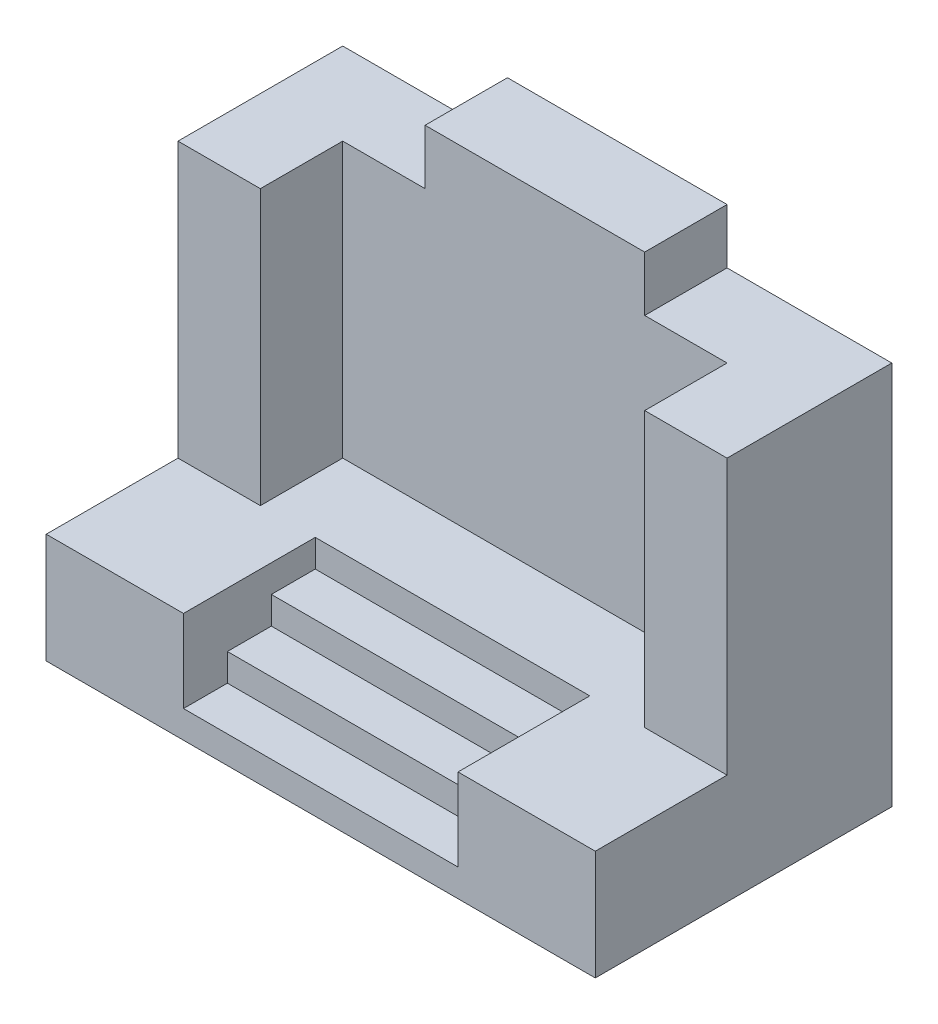
ISO-10303-21;
HEADER;
FILE_DESCRIPTION(('STEP AP214'),'2;1');
FILE_NAME('part.step','',(''),(''),'','','');
FILE_SCHEMA(('AUTOMOTIVE_DESIGN { 1 0 10303 214 1 1 1 1 }'));
ENDSEC;
DATA;
#1=APPLICATION_CONTEXT('core data for automotive mechanical design processes');
#2=APPLICATION_PROTOCOL_DEFINITION('international standard','automotive_design',2000,#1);
#3=PRODUCT_CONTEXT('',#1,'mechanical');
#4=PRODUCT('Part','Part','',(#3));
#5=PRODUCT_RELATED_PRODUCT_CATEGORY('part','',(#4));
#6=PRODUCT_DEFINITION_FORMATION('','',#4);
#7=PRODUCT_DEFINITION_CONTEXT('part definition',#1,'design');
#8=PRODUCT_DEFINITION('design','',#6,#7);
#9=PRODUCT_DEFINITION_SHAPE('','',#8);
#10=(LENGTH_UNIT() NAMED_UNIT(*) SI_UNIT(.MILLI.,.METRE.));
#11=(NAMED_UNIT(*) PLANE_ANGLE_UNIT() SI_UNIT($,.RADIAN.));
#12=(NAMED_UNIT(*) SI_UNIT($,.STERADIAN.) SOLID_ANGLE_UNIT());
#13=UNCERTAINTY_MEASURE_WITH_UNIT(LENGTH_MEASURE(1.E-05),#10,'distance_accuracy_value','');
#14=(GEOMETRIC_REPRESENTATION_CONTEXT(3) GLOBAL_UNCERTAINTY_ASSIGNED_CONTEXT((#13)) GLOBAL_UNIT_ASSIGNED_CONTEXT((#10,
#11,#12)) REPRESENTATION_CONTEXT('',''));
#15=CARTESIAN_POINT('',(0.,0.,0.));
#16=DIRECTION('',(0.,0.,1.));
#17=DIRECTION('',(1.,0.,0.));
#18=AXIS2_PLACEMENT_3D('',#15,#16,#17);
#19=CARTESIAN_POINT('',(-250.,200.,0.));
#20=DIRECTION('',(-1.,0.,0.));
#21=DIRECTION('',(0.,0.,1.));
#22=AXIS2_PLACEMENT_3D('',#19,#20,#21);
#23=PLANE('',#22);
#24=DIRECTION('',(0.,-1.,0.));
#25=VECTOR('',#24,1.);
#26=CARTESIAN_POINT('',(-250.,200.,0.));
#27=LINE('',#26,#25);
#28=CARTESIAN_POINT('',(-250.,200.,0.));
#29=VERTEX_POINT('',#28);
#30=CARTESIAN_POINT('',(-250.,50.,0.));
#31=VERTEX_POINT('',#30);
#32=EDGE_CURVE('E205',#29,#31,#27,.T.);
#33=ORIENTED_EDGE('',*,*,#32,.T.);
#34=DIRECTION('',(0.,0.,-1.));
#35=VECTOR('',#34,1.);
#36=CARTESIAN_POINT('',(-250.,50.,0.));
#37=LINE('',#36,#35);
#38=CARTESIAN_POINT('',(-250.,50.,-80.));
#39=VERTEX_POINT('',#38);
#40=EDGE_CURVE('E186',#31,#39,#37,.T.);
#41=ORIENTED_EDGE('',*,*,#40,.T.);
#42=DIRECTION('',(0.,-1.,0.));
#43=VECTOR('',#42,1.);
#44=CARTESIAN_POINT('',(-250.,100.,-80.));
#45=LINE('',#44,#43);
#46=CARTESIAN_POINT('',(-250.,100.,-80.));
#47=VERTEX_POINT('',#46);
#48=EDGE_CURVE('E200',#47,#39,#45,.T.);
#49=ORIENTED_EDGE('',*,*,#48,.F.);
#50=DIRECTION('',(0.,0.,-1.));
#51=VECTOR('',#50,1.);
#52=CARTESIAN_POINT('',(-250.,100.,0.));
#53=LINE('',#52,#51);
#54=CARTESIAN_POINT('',(-250.,100.,-160.));
#55=VERTEX_POINT('',#54);
#56=EDGE_CURVE('E207',#47,#55,#53,.T.);
#57=ORIENTED_EDGE('',*,*,#56,.T.);
#58=DIRECTION('',(0.,-1.,0.));
#59=VECTOR('',#58,1.);
#60=CARTESIAN_POINT('',(-250.,150.,-160.));
#61=LINE('',#60,#59);
#62=CARTESIAN_POINT('',(-250.,150.,-160.));
#63=VERTEX_POINT('',#62);
#64=EDGE_CURVE('E226',#63,#55,#61,.T.);
#65=ORIENTED_EDGE('',*,*,#64,.F.);
#66=DIRECTION('',(0.,0.,-1.));
#67=VECTOR('',#66,1.);
#68=CARTESIAN_POINT('',(-250.,150.,0.));
#69=LINE('',#68,#67);
#70=CARTESIAN_POINT('',(-250.,150.,-240.));
#71=VERTEX_POINT('',#70);
#72=EDGE_CURVE('E211',#63,#71,#69,.T.);
#73=ORIENTED_EDGE('',*,*,#72,.T.);
#74=DIRECTION('',(0.,-1.,0.));
#75=VECTOR('',#74,1.);
#76=CARTESIAN_POINT('',(-250.,200.,-240.));
#77=LINE('',#76,#75);
#78=CARTESIAN_POINT('',(-250.,200.,-240.));
#79=VERTEX_POINT('',#78);
#80=EDGE_CURVE('E324',#79,#71,#77,.T.);
#81=ORIENTED_EDGE('',*,*,#80,.F.);
#82=DIRECTION('',(0.,0.,-1.));
#83=VECTOR('',#82,1.);
#84=CARTESIAN_POINT('',(-250.,200.,0.));
#85=LINE('',#84,#83);
#86=EDGE_CURVE('E303',#29,#79,#85,.T.);
#87=ORIENTED_EDGE('',*,*,#86,.F.);
#88=EDGE_LOOP('',(#33,#41,#49,#57,#65,#73,#81,#87));
#89=FACE_BOUND('',#88,.T.);
#90=ADVANCED_FACE('F39',(#89),#23,.F.);
#91=CARTESIAN_POINT('',(0.,700.,-540.));
#92=DIRECTION('',(0.,0.,-1.));
#93=DIRECTION('',(-1.,0.,0.));
#94=AXIS2_PLACEMENT_3D('',#91,#92,#93);
#95=PLANE('',#94);
#96=DIRECTION('',(1.,0.,0.));
#97=VECTOR('',#96,1.);
#98=CARTESIAN_POINT('',(0.,0.,-540.));
#99=LINE('',#98,#97);
#100=CARTESIAN_POINT('',(-500.,0.,-540.));
#101=VERTEX_POINT('',#100);
#102=CARTESIAN_POINT('',(500.,0.,-540.));
#103=VERTEX_POINT('',#102);
#104=EDGE_CURVE('E332',#101,#103,#99,.T.);
#105=ORIENTED_EDGE('',*,*,#104,.F.);
#106=DIRECTION('',(0.,-1.,0.));
#107=VECTOR('',#106,1.);
#108=CARTESIAN_POINT('',(-500.,700.,-540.));
#109=LINE('',#108,#107);
#110=CARTESIAN_POINT('',(-500.,700.,-540.));
#111=VERTEX_POINT('',#110);
#112=EDGE_CURVE('E279',#111,#101,#109,.T.);
#113=ORIENTED_EDGE('',*,*,#112,.F.);
#114=DIRECTION('',(1.,0.,0.));
#115=VECTOR('',#114,1.);
#116=CARTESIAN_POINT('',(0.,700.,-540.));
#117=LINE('',#116,#115);
#118=CARTESIAN_POINT('',(-200.,700.,-540.));
#119=VERTEX_POINT('',#118);
#120=EDGE_CURVE('E259',#111,#119,#117,.T.);
#121=ORIENTED_EDGE('',*,*,#120,.T.);
#122=DIRECTION('',(0.,-1.,0.));
#123=VECTOR('',#122,1.);
#124=CARTESIAN_POINT('',(-200.,800.,-540.));
#125=LINE('',#124,#123);
#126=CARTESIAN_POINT('',(-200.,800.,-540.));
#127=VERTEX_POINT('',#126);
#128=EDGE_CURVE('E244',#127,#119,#125,.T.);
#129=ORIENTED_EDGE('',*,*,#128,.F.);
#130=DIRECTION('',(1.,0.,0.));
#131=VECTOR('',#130,1.);
#132=CARTESIAN_POINT('',(0.,800.,-540.));
#133=LINE('',#132,#131);
#134=CARTESIAN_POINT('',(200.,800.,-540.));
#135=VERTEX_POINT('',#134);
#136=EDGE_CURVE('E238',#127,#135,#133,.T.);
#137=ORIENTED_EDGE('',*,*,#136,.T.);
#138=DIRECTION('',(0.,-1.,0.));
#139=VECTOR('',#138,1.);
#140=CARTESIAN_POINT('',(200.,800.,-540.));
#141=LINE('',#140,#139);
#142=CARTESIAN_POINT('',(200.,700.,-540.));
#143=VERTEX_POINT('',#142);
#144=EDGE_CURVE('E243',#135,#143,#141,.T.);
#145=ORIENTED_EDGE('',*,*,#144,.T.);
#146=DIRECTION('',(1.,0.,0.));
#147=VECTOR('',#146,1.);
#148=CARTESIAN_POINT('',(0.,700.,-540.));
#149=LINE('',#148,#147);
#150=CARTESIAN_POINT('',(500.,700.,-540.));
#151=VERTEX_POINT('',#150);
#152=EDGE_CURVE('E335',#143,#151,#149,.T.);
#153=ORIENTED_EDGE('',*,*,#152,.T.);
#154=DIRECTION('',(0.,-1.,0.));
#155=VECTOR('',#154,1.);
#156=CARTESIAN_POINT('',(500.,700.,-540.));
#157=LINE('',#156,#155);
#158=EDGE_CURVE('E350',#151,#103,#157,.T.);
#159=ORIENTED_EDGE('',*,*,#158,.T.);
#160=EDGE_LOOP('',(#105,#113,#121,#129,#137,#145,#153,#159));
#161=FACE_BOUND('',#160,.T.);
#162=ADVANCED_FACE('F41',(#161),#95,.T.);
#163=CARTESIAN_POINT('',(0.,700.,-390.));
#164=DIRECTION('',(0.,0.,-1.));
#165=DIRECTION('',(-1.,0.,0.));
#166=AXIS2_PLACEMENT_3D('',#163,#164,#165);
#167=PLANE('',#166);
#168=DIRECTION('',(1.,0.,0.));
#169=VECTOR('',#168,1.);
#170=CARTESIAN_POINT('',(0.,700.,-390.));
#171=LINE('',#170,#169);
#172=CARTESIAN_POINT('',(200.,700.,-390.));
#173=VERTEX_POINT('',#172);
#174=CARTESIAN_POINT('',(350.,700.,-390.));
#175=VERTEX_POINT('',#174);
#176=EDGE_CURVE('E336',#173,#175,#171,.T.);
#177=ORIENTED_EDGE('',*,*,#176,.F.);
#178=DIRECTION('',(0.,-1.,0.));
#179=VECTOR('',#178,1.);
#180=CARTESIAN_POINT('',(200.,800.,-390.));
#181=LINE('',#180,#179);
#182=CARTESIAN_POINT('',(200.,800.,-390.));
#183=VERTEX_POINT('',#182);
#184=EDGE_CURVE('E248',#183,#173,#181,.T.);
#185=ORIENTED_EDGE('',*,*,#184,.F.);
#186=DIRECTION('',(1.,0.,0.));
#187=VECTOR('',#186,1.);
#188=CARTESIAN_POINT('',(0.,800.,-390.));
#189=LINE('',#188,#187);
#190=CARTESIAN_POINT('',(-200.,800.,-390.));
#191=VERTEX_POINT('',#190);
#192=EDGE_CURVE('E231',#191,#183,#189,.T.);
#193=ORIENTED_EDGE('',*,*,#192,.F.);
#194=DIRECTION('',(0.,-1.,0.));
#195=VECTOR('',#194,1.);
#196=CARTESIAN_POINT('',(-200.,800.,-390.));
#197=LINE('',#196,#195);
#198=CARTESIAN_POINT('',(-200.,700.,-390.));
#199=VERTEX_POINT('',#198);
#200=EDGE_CURVE('E246',#191,#199,#197,.T.);
#201=ORIENTED_EDGE('',*,*,#200,.T.);
#202=DIRECTION('',(1.,0.,0.));
#203=VECTOR('',#202,1.);
#204=CARTESIAN_POINT('',(0.,700.,-390.));
#205=LINE('',#204,#203);
#206=CARTESIAN_POINT('',(-350.,700.,-390.));
#207=VERTEX_POINT('',#206);
#208=EDGE_CURVE('E251',#207,#199,#205,.T.);
#209=ORIENTED_EDGE('',*,*,#208,.F.);
#210=DIRECTION('',(0.,-1.,0.));
#211=VECTOR('',#210,1.);
#212=CARTESIAN_POINT('',(-350.,700.,-390.));
#213=LINE('',#212,#211);
#214=CARTESIAN_POINT('',(-350.,200.,-390.));
#215=VERTEX_POINT('',#214);
#216=EDGE_CURVE('E267',#207,#215,#213,.T.);
#217=ORIENTED_EDGE('',*,*,#216,.T.);
#218=DIRECTION('',(1.,0.,0.));
#219=VECTOR('',#218,1.);
#220=CARTESIAN_POINT('',(0.,200.,-390.));
#221=LINE('',#220,#219);
#222=CARTESIAN_POINT('',(350.,200.,-390.));
#223=VERTEX_POINT('',#222);
#224=EDGE_CURVE('E289',#215,#223,#221,.T.);
#225=ORIENTED_EDGE('',*,*,#224,.T.);
#226=DIRECTION('',(0.,-1.,0.));
#227=VECTOR('',#226,1.);
#228=CARTESIAN_POINT('',(350.,700.,-390.));
#229=LINE('',#228,#227);
#230=EDGE_CURVE('E11',#175,#223,#229,.T.);
#231=ORIENTED_EDGE('',*,*,#230,.F.);
#232=EDGE_LOOP('',(#177,#185,#193,#201,#209,#217,#225,#231));
#233=FACE_BOUND('',#232,.T.);
#234=ADVANCED_FACE('F369',(#233),#167,.F.);
#235=CARTESIAN_POINT('',(350.,700.,-2.59052039079203E-13));
#236=DIRECTION('',(1.,0.,0.));
#237=DIRECTION('',(0.,0.,-1.));
#238=AXIS2_PLACEMENT_3D('',#235,#236,#237);
#239=PLANE('',#238);
#240=ORIENTED_EDGE('',*,*,#230,.T.);
#241=DIRECTION('',(0.,0.,1.));
#242=VECTOR('',#241,1.);
#243=CARTESIAN_POINT('',(350.,200.,-2.59052039079203E-13));
#244=LINE('',#243,#242);
#245=CARTESIAN_POINT('',(350.,200.,-240.));
#246=VERTEX_POINT('',#245);
#247=EDGE_CURVE('E283',#223,#246,#244,.T.);
#248=ORIENTED_EDGE('',*,*,#247,.T.);
#249=DIRECTION('',(0.,-1.,0.));
#250=VECTOR('',#249,1.);
#251=CARTESIAN_POINT('',(350.,700.,-240.));
#252=LINE('',#251,#250);
#253=CARTESIAN_POINT('',(350.,700.,-240.));
#254=VERTEX_POINT('',#253);
#255=EDGE_CURVE('E50',#254,#246,#252,.T.);
#256=ORIENTED_EDGE('',*,*,#255,.F.);
#257=DIRECTION('',(0.,0.,1.));
#258=VECTOR('',#257,1.);
#259=CARTESIAN_POINT('',(350.,700.,-2.59052039079203E-13));
#260=LINE('',#259,#258);
#261=EDGE_CURVE('E342',#175,#254,#260,.T.);
#262=ORIENTED_EDGE('',*,*,#261,.F.);
#263=EDGE_LOOP('',(#240,#248,#256,#262));
#264=FACE_BOUND('',#263,.T.);
#265=ADVANCED_FACE('F361',(#264),#239,.F.);
#266=CARTESIAN_POINT('',(0.,700.,-240.));
#267=DIRECTION('',(0.,0.,-1.));
#268=DIRECTION('',(-1.,0.,0.));
#269=AXIS2_PLACEMENT_3D('',#266,#267,#268);
#270=PLANE('',#269);
#271=ORIENTED_EDGE('',*,*,#255,.T.);
#272=DIRECTION('',(1.,0.,0.));
#273=VECTOR('',#272,1.);
#274=CARTESIAN_POINT('',(0.,200.,-240.));
#275=LINE('',#274,#273);
#276=CARTESIAN_POINT('',(500.,200.,-240.));
#277=VERTEX_POINT('',#276);
#278=EDGE_CURVE('E285',#246,#277,#275,.T.);
#279=ORIENTED_EDGE('',*,*,#278,.T.);
#280=DIRECTION('',(0.,-1.,0.));
#281=VECTOR('',#280,1.);
#282=CARTESIAN_POINT('',(500.,700.,-240.));
#283=LINE('',#282,#281);
#284=CARTESIAN_POINT('',(500.,700.,-240.));
#285=VERTEX_POINT('',#284);
#286=EDGE_CURVE('E354',#285,#277,#283,.T.);
#287=ORIENTED_EDGE('',*,*,#286,.F.);
#288=DIRECTION('',(1.,0.,0.));
#289=VECTOR('',#288,1.);
#290=CARTESIAN_POINT('',(0.,700.,-240.));
#291=LINE('',#290,#289);
#292=EDGE_CURVE('E343',#254,#285,#291,.T.);
#293=ORIENTED_EDGE('',*,*,#292,.F.);
#294=EDGE_LOOP('',(#271,#279,#287,#293));
#295=FACE_BOUND('',#294,.T.);
#296=ADVANCED_FACE('F359',(#295),#270,.F.);
#297=CARTESIAN_POINT('',(500.,700.,-1.02798428206033E-13));
#298=DIRECTION('',(-1.,0.,0.));
#299=DIRECTION('',(0.,0.,1.));
#300=AXIS2_PLACEMENT_3D('',#297,#298,#299);
#301=PLANE('',#300);
#302=DIRECTION('',(0.,0.,-1.));
#303=VECTOR('',#302,1.);
#304=CARTESIAN_POINT('',(500.,0.,-1.02798428206033E-13));
#305=LINE('',#304,#303);
#306=CARTESIAN_POINT('',(500.,0.,-1.11022302462516E-13));
#307=VERTEX_POINT('',#306);
#308=EDGE_CURVE('E337',#307,#103,#305,.T.);
#309=ORIENTED_EDGE('',*,*,#308,.T.);
#310=ORIENTED_EDGE('',*,*,#158,.F.);
#311=DIRECTION('',(0.,0.,-1.));
#312=VECTOR('',#311,1.);
#313=CARTESIAN_POINT('',(500.,700.,-1.02798428206033E-13));
#314=LINE('',#313,#312);
#315=EDGE_CURVE('E341',#285,#151,#314,.T.);
#316=ORIENTED_EDGE('',*,*,#315,.F.);
#317=ORIENTED_EDGE('',*,*,#286,.T.);
#318=DIRECTION('',(0.,0.,-1.));
#319=VECTOR('',#318,1.);
#320=CARTESIAN_POINT('',(500.,200.,-1.02798428206033E-13));
#321=LINE('',#320,#319);
#322=CARTESIAN_POINT('',(500.,200.,-1.11022302462516E-13));
#323=VERTEX_POINT('',#322);
#324=EDGE_CURVE('E313',#323,#277,#321,.T.);
#325=ORIENTED_EDGE('',*,*,#324,.F.);
#326=DIRECTION('',(0.,-1.,0.));
#327=VECTOR('',#326,1.);
#328=CARTESIAN_POINT('',(500.,200.,-1.11022302462516E-13));
#329=LINE('',#328,#327);
#330=EDGE_CURVE('E311',#323,#307,#329,.T.);
#331=ORIENTED_EDGE('',*,*,#330,.T.);
#332=EDGE_LOOP('',(#309,#310,#316,#317,#325,#331));
#333=FACE_BOUND('',#332,.T.);
#334=ADVANCED_FACE('F404',(#333),#301,.F.);
#335=CARTESIAN_POINT('',(0.,700.,0.));
#336=DIRECTION('',(0.,1.,0.));
#337=DIRECTION('',(0.,0.,1.));
#338=AXIS2_PLACEMENT_3D('',#335,#336,#337);
#339=PLANE('',#338);
#340=ORIENTED_EDGE('',*,*,#152,.F.);
#341=DIRECTION('',(0.,0.,1.));
#342=VECTOR('',#341,1.);
#343=CARTESIAN_POINT('',(200.,700.,0.));
#344=LINE('',#343,#342);
#345=EDGE_CURVE('E333',#143,#173,#344,.T.);
#346=ORIENTED_EDGE('',*,*,#345,.T.);
#347=ORIENTED_EDGE('',*,*,#176,.T.);
#348=ORIENTED_EDGE('',*,*,#261,.T.);
#349=ORIENTED_EDGE('',*,*,#292,.T.);
#350=ORIENTED_EDGE('',*,*,#315,.T.);
#351=EDGE_LOOP('',(#340,#346,#347,#348,#349,#350));
#352=FACE_BOUND('',#351,.T.);
#353=ADVANCED_FACE('F406',(#352),#339,.T.);
#354=CARTESIAN_POINT('',(0.,0.,0.));
#355=DIRECTION('',(0.,1.,0.));
#356=DIRECTION('',(0.,0.,1.));
#357=AXIS2_PLACEMENT_3D('',#354,#355,#356);
#358=PLANE('',#357);
#359=ORIENTED_EDGE('',*,*,#308,.F.);
#360=DIRECTION('',(1.,0.,0.));
#361=VECTOR('',#360,1.);
#362=CARTESIAN_POINT('',(0.,0.,0.));
#363=LINE('',#362,#361);
#364=CARTESIAN_POINT('',(-500.,0.,0.));
#365=VERTEX_POINT('',#364);
#366=EDGE_CURVE('E287',#365,#307,#363,.T.);
#367=ORIENTED_EDGE('',*,*,#366,.F.);
#368=DIRECTION('',(0.,0.,-1.));
#369=VECTOR('',#368,1.);
#370=CARTESIAN_POINT('',(-500.,0.,0.));
#371=LINE('',#370,#369);
#372=EDGE_CURVE('E282',#365,#101,#371,.T.);
#373=ORIENTED_EDGE('',*,*,#372,.T.);
#374=ORIENTED_EDGE('',*,*,#104,.T.);
#375=EDGE_LOOP('',(#359,#367,#373,#374));
#376=FACE_BOUND('',#375,.T.);
#377=ADVANCED_FACE('F450',(#376),#358,.F.);
#378=CARTESIAN_POINT('',(-500.,200.,0.));
#379=DIRECTION('',(-1.,0.,0.));
#380=DIRECTION('',(0.,0.,1.));
#381=AXIS2_PLACEMENT_3D('',#378,#379,#380);
#382=PLANE('',#381);
#383=ORIENTED_EDGE('',*,*,#372,.F.);
#384=DIRECTION('',(0.,-1.,0.));
#385=VECTOR('',#384,1.);
#386=CARTESIAN_POINT('',(-500.,200.,0.));
#387=LINE('',#386,#385);
#388=CARTESIAN_POINT('',(-500.,200.,0.));
#389=VERTEX_POINT('',#388);
#390=EDGE_CURVE('E328',#389,#365,#387,.T.);
#391=ORIENTED_EDGE('',*,*,#390,.F.);
#392=DIRECTION('',(0.,0.,-1.));
#393=VECTOR('',#392,1.);
#394=CARTESIAN_POINT('',(-500.,200.,0.));
#395=LINE('',#394,#393);
#396=CARTESIAN_POINT('',(-500.,200.,-240.));
#397=VERTEX_POINT('',#396);
#398=EDGE_CURVE('E299',#389,#397,#395,.T.);
#399=ORIENTED_EDGE('',*,*,#398,.T.);
#400=DIRECTION('',(0.,-1.,0.));
#401=VECTOR('',#400,1.);
#402=CARTESIAN_POINT('',(-500.,700.,-240.));
#403=LINE('',#402,#401);
#404=CARTESIAN_POINT('',(-500.,700.,-240.));
#405=VERTEX_POINT('',#404);
#406=EDGE_CURVE('E274',#405,#397,#403,.T.);
#407=ORIENTED_EDGE('',*,*,#406,.F.);
#408=DIRECTION('',(0.,0.,-1.));
#409=VECTOR('',#408,1.);
#410=CARTESIAN_POINT('',(-500.,700.,0.));
#411=LINE('',#410,#409);
#412=EDGE_CURVE('E265',#405,#111,#411,.T.);
#413=ORIENTED_EDGE('',*,*,#412,.T.);
#414=ORIENTED_EDGE('',*,*,#112,.T.);
#415=EDGE_LOOP('',(#383,#391,#399,#407,#413,#414));
#416=FACE_BOUND('',#415,.T.);
#417=ADVANCED_FACE('F382',(#416),#382,.T.);
#418=CARTESIAN_POINT('',(0.,200.,0.));
#419=DIRECTION('',(0.,0.,-1.));
#420=DIRECTION('',(-1.,0.,0.));
#421=AXIS2_PLACEMENT_3D('',#418,#419,#420);
#422=PLANE('',#421);
#423=ORIENTED_EDGE('',*,*,#366,.T.);
#424=ORIENTED_EDGE('',*,*,#330,.F.);
#425=DIRECTION('',(1.,0.,0.));
#426=VECTOR('',#425,1.);
#427=CARTESIAN_POINT('',(0.,200.,0.));
#428=LINE('',#427,#426);
#429=CARTESIAN_POINT('',(250.,200.,0.));
#430=VERTEX_POINT('',#429);
#431=EDGE_CURVE('E304',#430,#323,#428,.T.);
#432=ORIENTED_EDGE('',*,*,#431,.F.);
#433=DIRECTION('',(0.,-1.,0.));
#434=VECTOR('',#433,1.);
#435=CARTESIAN_POINT('',(250.,200.,0.));
#436=LINE('',#435,#434);
#437=CARTESIAN_POINT('',(250.,50.,0.));
#438=VERTEX_POINT('',#437);
#439=EDGE_CURVE('E317',#430,#438,#436,.T.);
#440=ORIENTED_EDGE('',*,*,#439,.T.);
#441=DIRECTION('',(1.,0.,0.));
#442=VECTOR('',#441,1.);
#443=CARTESIAN_POINT('',(0.,50.,0.));
#444=LINE('',#443,#442);
#445=EDGE_CURVE('E201',#31,#438,#444,.T.);
#446=ORIENTED_EDGE('',*,*,#445,.F.);
#447=ORIENTED_EDGE('',*,*,#32,.F.);
#448=EDGE_CURVE('E302',#389,#29,#428,.T.);
#449=ORIENTED_EDGE('',*,*,#448,.F.);
#450=ORIENTED_EDGE('',*,*,#390,.T.);
#451=EDGE_LOOP('',(#423,#424,#432,#440,#446,#447,#449,#450));
#452=FACE_BOUND('',#451,.T.);
#453=ADVANCED_FACE('F390',(#452),#422,.F.);
#454=CARTESIAN_POINT('',(0.,200.,-240.));
#455=DIRECTION('',(0.,0.,-1.));
#456=DIRECTION('',(-1.,0.,0.));
#457=AXIS2_PLACEMENT_3D('',#454,#455,#456);
#458=PLANE('',#457);
#459=ORIENTED_EDGE('',*,*,#80,.T.);
#460=DIRECTION('',(1.,0.,0.));
#461=VECTOR('',#460,1.);
#462=CARTESIAN_POINT('',(0.,150.,-240.));
#463=LINE('',#462,#461);
#464=CARTESIAN_POINT('',(250.,150.,-240.));
#465=VERTEX_POINT('',#464);
#466=EDGE_CURVE('E224',#71,#465,#463,.T.);
#467=ORIENTED_EDGE('',*,*,#466,.T.);
#468=DIRECTION('',(0.,-1.,0.));
#469=VECTOR('',#468,1.);
#470=CARTESIAN_POINT('',(250.,200.,-240.));
#471=LINE('',#470,#469);
#472=CARTESIAN_POINT('',(250.,200.,-240.));
#473=VERTEX_POINT('',#472);
#474=EDGE_CURVE('E325',#473,#465,#471,.T.);
#475=ORIENTED_EDGE('',*,*,#474,.F.);
#476=DIRECTION('',(1.,0.,0.));
#477=VECTOR('',#476,1.);
#478=CARTESIAN_POINT('',(0.,200.,-240.));
#479=LINE('',#478,#477);
#480=EDGE_CURVE('E308',#79,#473,#479,.T.);
#481=ORIENTED_EDGE('',*,*,#480,.F.);
#482=EDGE_LOOP('',(#459,#467,#475,#481));
#483=FACE_BOUND('',#482,.T.);
#484=ADVANCED_FACE('F394',(#483),#458,.F.);
#485=CARTESIAN_POINT('',(250.,200.,0.));
#486=DIRECTION('',(-1.,0.,0.));
#487=DIRECTION('',(0.,0.,1.));
#488=AXIS2_PLACEMENT_3D('',#485,#486,#487);
#489=PLANE('',#488);
#490=DIRECTION('',(0.,0.,-1.));
#491=VECTOR('',#490,1.);
#492=CARTESIAN_POINT('',(250.,50.,0.));
#493=LINE('',#492,#491);
#494=CARTESIAN_POINT('',(250.,50.,-80.));
#495=VERTEX_POINT('',#494);
#496=EDGE_CURVE('E53',#438,#495,#493,.T.);
#497=ORIENTED_EDGE('',*,*,#496,.F.);
#498=ORIENTED_EDGE('',*,*,#439,.F.);
#499=DIRECTION('',(0.,0.,-1.));
#500=VECTOR('',#499,1.);
#501=CARTESIAN_POINT('',(250.,200.,0.));
#502=LINE('',#501,#500);
#503=EDGE_CURVE('E306',#430,#473,#502,.T.);
#504=ORIENTED_EDGE('',*,*,#503,.T.);
#505=ORIENTED_EDGE('',*,*,#474,.T.);
#506=DIRECTION('',(0.,0.,-1.));
#507=VECTOR('',#506,1.);
#508=CARTESIAN_POINT('',(250.,150.,0.));
#509=LINE('',#508,#507);
#510=CARTESIAN_POINT('',(250.,150.,-160.));
#511=VERTEX_POINT('',#510);
#512=EDGE_CURVE('E222',#511,#465,#509,.T.);
#513=ORIENTED_EDGE('',*,*,#512,.F.);
#514=DIRECTION('',(0.,-1.,0.));
#515=VECTOR('',#514,1.);
#516=CARTESIAN_POINT('',(250.,150.,-160.));
#517=LINE('',#516,#515);
#518=CARTESIAN_POINT('',(250.,100.,-160.));
#519=VERTEX_POINT('',#518);
#520=EDGE_CURVE('E227',#511,#519,#517,.T.);
#521=ORIENTED_EDGE('',*,*,#520,.T.);
#522=DIRECTION('',(0.,0.,-1.));
#523=VECTOR('',#522,1.);
#524=CARTESIAN_POINT('',(250.,100.,0.));
#525=LINE('',#524,#523);
#526=CARTESIAN_POINT('',(250.,100.,-80.));
#527=VERTEX_POINT('',#526);
#528=EDGE_CURVE('E65',#527,#519,#525,.T.);
#529=ORIENTED_EDGE('',*,*,#528,.F.);
#530=DIRECTION('',(0.,-1.,0.));
#531=VECTOR('',#530,1.);
#532=CARTESIAN_POINT('',(250.,100.,-80.));
#533=LINE('',#532,#531);
#534=EDGE_CURVE('E208',#527,#495,#533,.T.);
#535=ORIENTED_EDGE('',*,*,#534,.T.);
#536=EDGE_LOOP('',(#497,#498,#504,#505,#513,#521,#529,#535));
#537=FACE_BOUND('',#536,.T.);
#538=ADVANCED_FACE('F398',(#537),#489,.T.);
#539=CARTESIAN_POINT('',(0.,200.,0.));
#540=DIRECTION('',(0.,1.,0.));
#541=DIRECTION('',(0.,0.,1.));
#542=AXIS2_PLACEMENT_3D('',#539,#540,#541);
#543=PLANE('',#542);
#544=ORIENTED_EDGE('',*,*,#278,.F.);
#545=ORIENTED_EDGE('',*,*,#247,.F.);
#546=ORIENTED_EDGE('',*,*,#224,.F.);
#547=DIRECTION('',(0.,0.,-1.));
#548=VECTOR('',#547,1.);
#549=CARTESIAN_POINT('',(-350.,200.,0.));
#550=LINE('',#549,#548);
#551=CARTESIAN_POINT('',(-350.,200.,-240.));
#552=VERTEX_POINT('',#551);
#553=EDGE_CURVE('E295',#552,#215,#550,.T.);
#554=ORIENTED_EDGE('',*,*,#553,.F.);
#555=DIRECTION('',(1.,0.,0.));
#556=VECTOR('',#555,1.);
#557=CARTESIAN_POINT('',(0.,200.,-240.));
#558=LINE('',#557,#556);
#559=EDGE_CURVE('E293',#397,#552,#558,.T.);
#560=ORIENTED_EDGE('',*,*,#559,.F.);
#561=ORIENTED_EDGE('',*,*,#398,.F.);
#562=ORIENTED_EDGE('',*,*,#448,.T.);
#563=ORIENTED_EDGE('',*,*,#86,.T.);
#564=ORIENTED_EDGE('',*,*,#480,.T.);
#565=ORIENTED_EDGE('',*,*,#503,.F.);
#566=ORIENTED_EDGE('',*,*,#431,.T.);
#567=ORIENTED_EDGE('',*,*,#324,.T.);
#568=EDGE_LOOP('',(#544,#545,#546,#554,#560,#561,#562,#563,#564,#565,#566,#567));
#569=FACE_BOUND('',#568,.T.);
#570=ADVANCED_FACE('F368',(#569),#543,.T.);
#571=CARTESIAN_POINT('',(0.,700.,-240.));
#572=DIRECTION('',(0.,0.,-1.));
#573=DIRECTION('',(-1.,0.,0.));
#574=AXIS2_PLACEMENT_3D('',#571,#572,#573);
#575=PLANE('',#574);
#576=ORIENTED_EDGE('',*,*,#559,.T.);
#577=DIRECTION('',(0.,-1.,0.));
#578=VECTOR('',#577,1.);
#579=CARTESIAN_POINT('',(-350.,700.,-240.));
#580=LINE('',#579,#578);
#581=CARTESIAN_POINT('',(-350.,700.,-240.));
#582=VERTEX_POINT('',#581);
#583=EDGE_CURVE('E275',#582,#552,#580,.T.);
#584=ORIENTED_EDGE('',*,*,#583,.F.);
#585=DIRECTION('',(1.,0.,0.));
#586=VECTOR('',#585,1.);
#587=CARTESIAN_POINT('',(0.,700.,-240.));
#588=LINE('',#587,#586);
#589=EDGE_CURVE('E264',#405,#582,#588,.T.);
#590=ORIENTED_EDGE('',*,*,#589,.F.);
#591=ORIENTED_EDGE('',*,*,#406,.T.);
#592=EDGE_LOOP('',(#576,#584,#590,#591));
#593=FACE_BOUND('',#592,.T.);
#594=ADVANCED_FACE('F378',(#593),#575,.F.);
#595=CARTESIAN_POINT('',(-350.,700.,0.));
#596=DIRECTION('',(-1.,0.,0.));
#597=DIRECTION('',(0.,0.,1.));
#598=AXIS2_PLACEMENT_3D('',#595,#596,#597);
#599=PLANE('',#598);
#600=ORIENTED_EDGE('',*,*,#553,.T.);
#601=ORIENTED_EDGE('',*,*,#216,.F.);
#602=DIRECTION('',(0.,0.,-1.));
#603=VECTOR('',#602,1.);
#604=CARTESIAN_POINT('',(-350.,700.,0.));
#605=LINE('',#604,#603);
#606=EDGE_CURVE('E270',#582,#207,#605,.T.);
#607=ORIENTED_EDGE('',*,*,#606,.F.);
#608=ORIENTED_EDGE('',*,*,#583,.T.);
#609=EDGE_LOOP('',(#600,#601,#607,#608));
#610=FACE_BOUND('',#609,.T.);
#611=ADVANCED_FACE('F372',(#610),#599,.F.);
#612=CARTESIAN_POINT('',(0.,700.,0.));
#613=DIRECTION('',(0.,1.,0.));
#614=DIRECTION('',(0.,0.,1.));
#615=AXIS2_PLACEMENT_3D('',#612,#613,#614);
#616=PLANE('',#615);
#617=ORIENTED_EDGE('',*,*,#208,.T.);
#618=DIRECTION('',(0.,0.,-1.));
#619=VECTOR('',#618,1.);
#620=CARTESIAN_POINT('',(-200.,700.,0.));
#621=LINE('',#620,#619);
#622=EDGE_CURVE('E258',#199,#119,#621,.T.);
#623=ORIENTED_EDGE('',*,*,#622,.T.);
#624=ORIENTED_EDGE('',*,*,#120,.F.);
#625=ORIENTED_EDGE('',*,*,#412,.F.);
#626=ORIENTED_EDGE('',*,*,#589,.T.);
#627=ORIENTED_EDGE('',*,*,#606,.T.);
#628=EDGE_LOOP('',(#617,#623,#624,#625,#626,#627));
#629=FACE_BOUND('',#628,.T.);
#630=ADVANCED_FACE('F424',(#629),#616,.T.);
#631=CARTESIAN_POINT('',(200.,800.,0.));
#632=DIRECTION('',(1.,0.,0.));
#633=DIRECTION('',(0.,0.,-1.));
#634=AXIS2_PLACEMENT_3D('',#631,#632,#633);
#635=PLANE('',#634);
#636=ORIENTED_EDGE('',*,*,#345,.F.);
#637=ORIENTED_EDGE('',*,*,#144,.F.);
#638=DIRECTION('',(0.,0.,1.));
#639=VECTOR('',#638,1.);
#640=CARTESIAN_POINT('',(200.,800.,0.));
#641=LINE('',#640,#639);
#642=EDGE_CURVE('E240',#135,#183,#641,.T.);
#643=ORIENTED_EDGE('',*,*,#642,.T.);
#644=ORIENTED_EDGE('',*,*,#184,.T.);
#645=EDGE_LOOP('',(#636,#637,#643,#644));
#646=FACE_BOUND('',#645,.T.);
#647=ADVANCED_FACE('F411',(#646),#635,.T.);
#648=CARTESIAN_POINT('',(-200.,800.,0.));
#649=DIRECTION('',(-1.,0.,0.));
#650=DIRECTION('',(0.,0.,1.));
#651=AXIS2_PLACEMENT_3D('',#648,#649,#650);
#652=PLANE('',#651);
#653=ORIENTED_EDGE('',*,*,#622,.F.);
#654=ORIENTED_EDGE('',*,*,#200,.F.);
#655=DIRECTION('',(0.,0.,-1.));
#656=VECTOR('',#655,1.);
#657=CARTESIAN_POINT('',(-200.,800.,0.));
#658=LINE('',#657,#656);
#659=EDGE_CURVE('E235',#191,#127,#658,.T.);
#660=ORIENTED_EDGE('',*,*,#659,.T.);
#661=ORIENTED_EDGE('',*,*,#128,.T.);
#662=EDGE_LOOP('',(#653,#654,#660,#661));
#663=FACE_BOUND('',#662,.T.);
#664=ADVANCED_FACE('F425',(#663),#652,.T.);
#665=CARTESIAN_POINT('',(0.,800.,0.));
#666=DIRECTION('',(0.,1.,0.));
#667=DIRECTION('',(0.,0.,1.));
#668=AXIS2_PLACEMENT_3D('',#665,#666,#667);
#669=PLANE('',#668);
#670=ORIENTED_EDGE('',*,*,#659,.F.);
#671=ORIENTED_EDGE('',*,*,#192,.T.);
#672=ORIENTED_EDGE('',*,*,#642,.F.);
#673=ORIENTED_EDGE('',*,*,#136,.F.);
#674=EDGE_LOOP('',(#670,#671,#672,#673));
#675=FACE_BOUND('',#674,.T.);
#676=ADVANCED_FACE('F416',(#675),#669,.T.);
#677=CARTESIAN_POINT('',(0.,150.,-160.));
#678=DIRECTION('',(0.,0.,-1.));
#679=DIRECTION('',(-1.,0.,0.));
#680=AXIS2_PLACEMENT_3D('',#677,#678,#679);
#681=PLANE('',#680);
#682=ORIENTED_EDGE('',*,*,#64,.T.);
#683=DIRECTION('',(1.,0.,0.));
#684=VECTOR('',#683,1.);
#685=CARTESIAN_POINT('',(0.,100.,-160.));
#686=LINE('',#685,#684);
#687=EDGE_CURVE('E213',#55,#519,#686,.T.);
#688=ORIENTED_EDGE('',*,*,#687,.T.);
#689=ORIENTED_EDGE('',*,*,#520,.F.);
#690=DIRECTION('',(1.,0.,0.));
#691=VECTOR('',#690,1.);
#692=CARTESIAN_POINT('',(0.,150.,-160.));
#693=LINE('',#692,#691);
#694=EDGE_CURVE('E218',#63,#511,#693,.T.);
#695=ORIENTED_EDGE('',*,*,#694,.F.);
#696=EDGE_LOOP('',(#682,#688,#689,#695));
#697=FACE_BOUND('',#696,.T.);
#698=ADVANCED_FACE('F619',(#697),#681,.F.);
#699=CARTESIAN_POINT('',(0.,150.,0.));
#700=DIRECTION('',(0.,1.,0.));
#701=DIRECTION('',(0.,0.,1.));
#702=AXIS2_PLACEMENT_3D('',#699,#700,#701);
#703=PLANE('',#702);
#704=ORIENTED_EDGE('',*,*,#72,.F.);
#705=ORIENTED_EDGE('',*,*,#694,.T.);
#706=ORIENTED_EDGE('',*,*,#512,.T.);
#707=ORIENTED_EDGE('',*,*,#466,.F.);
#708=EDGE_LOOP('',(#704,#705,#706,#707));
#709=FACE_BOUND('',#708,.T.);
#710=ADVANCED_FACE('F572',(#709),#703,.T.);
#711=CARTESIAN_POINT('',(0.,100.,-80.));
#712=DIRECTION('',(0.,0.,-1.));
#713=DIRECTION('',(-1.,0.,0.));
#714=AXIS2_PLACEMENT_3D('',#711,#712,#713);
#715=PLANE('',#714);
#716=ORIENTED_EDGE('',*,*,#48,.T.);
#717=DIRECTION('',(1.,0.,0.));
#718=VECTOR('',#717,1.);
#719=CARTESIAN_POINT('',(0.,50.,-80.));
#720=LINE('',#719,#718);
#721=EDGE_CURVE('E187',#39,#495,#720,.T.);
#722=ORIENTED_EDGE('',*,*,#721,.T.);
#723=ORIENTED_EDGE('',*,*,#534,.F.);
#724=DIRECTION('',(1.,0.,0.));
#725=VECTOR('',#724,1.);
#726=CARTESIAN_POINT('',(0.,100.,-80.));
#727=LINE('',#726,#725);
#728=EDGE_CURVE('E206',#47,#527,#727,.T.);
#729=ORIENTED_EDGE('',*,*,#728,.F.);
#730=EDGE_LOOP('',(#716,#722,#723,#729));
#731=FACE_BOUND('',#730,.T.);
#732=ADVANCED_FACE('F202',(#731),#715,.F.);
#733=CARTESIAN_POINT('',(0.,100.,0.));
#734=DIRECTION('',(0.,1.,0.));
#735=DIRECTION('',(0.,0.,1.));
#736=AXIS2_PLACEMENT_3D('',#733,#734,#735);
#737=PLANE('',#736);
#738=ORIENTED_EDGE('',*,*,#728,.T.);
#739=ORIENTED_EDGE('',*,*,#528,.T.);
#740=ORIENTED_EDGE('',*,*,#687,.F.);
#741=ORIENTED_EDGE('',*,*,#56,.F.);
#742=EDGE_LOOP('',(#738,#739,#740,#741));
#743=FACE_BOUND('',#742,.T.);
#744=ADVANCED_FACE('F568',(#743),#737,.T.);
#745=CARTESIAN_POINT('',(0.,50.,0.));
#746=DIRECTION('',(0.,1.,0.));
#747=DIRECTION('',(0.,0.,1.));
#748=AXIS2_PLACEMENT_3D('',#745,#746,#747);
#749=PLANE('',#748);
#750=ORIENTED_EDGE('',*,*,#721,.F.);
#751=ORIENTED_EDGE('',*,*,#40,.F.);
#752=ORIENTED_EDGE('',*,*,#445,.T.);
#753=ORIENTED_EDGE('',*,*,#496,.T.);
#754=EDGE_LOOP('',(#750,#751,#752,#753));
#755=FACE_BOUND('',#754,.T.);
#756=ADVANCED_FACE('F189',(#755),#749,.T.);
#757=CLOSED_SHELL('',(#90,#162,#234,#265,#296,#334,#353,#377,#417,#453,#484,#538,#570,#594,#611,
#630,#647,#664,#676,#698,#710,#732,#744,#756));
#758=MANIFOLD_SOLID_BREP('B2',#757);
#759=ADVANCED_BREP_SHAPE_REPRESENTATION('',(#18,#758),#14);
#760=SHAPE_DEFINITION_REPRESENTATION(#9,#759);
ENDSEC;
END-ISO-10303-21;
